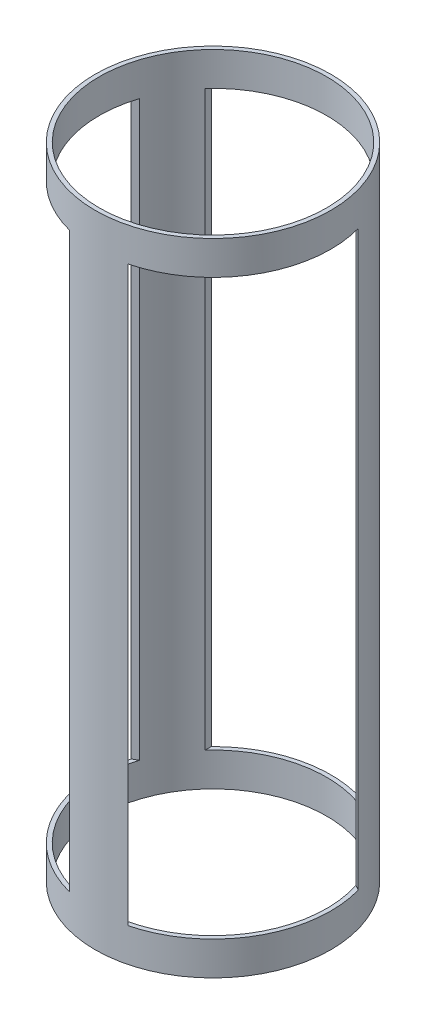
ISO-10303-21;
HEADER;
FILE_DESCRIPTION(('STEP AP214'),'2;1');
FILE_NAME('part.step','',(''),(''),'','','');
FILE_SCHEMA(('AUTOMOTIVE_DESIGN { 1 0 10303 214 1 1 1 1 }'));
ENDSEC;
DATA;
#1=APPLICATION_CONTEXT('core data for automotive mechanical design processes');
#2=APPLICATION_PROTOCOL_DEFINITION('international standard','automotive_design',2000,#1);
#3=PRODUCT_CONTEXT('',#1,'mechanical');
#4=PRODUCT('Part','Part','',(#3));
#5=PRODUCT_RELATED_PRODUCT_CATEGORY('part','',(#4));
#6=PRODUCT_DEFINITION_FORMATION('','',#4);
#7=PRODUCT_DEFINITION_CONTEXT('part definition',#1,'design');
#8=PRODUCT_DEFINITION('design','',#6,#7);
#9=PRODUCT_DEFINITION_SHAPE('','',#8);
#10=(LENGTH_UNIT() NAMED_UNIT(*) SI_UNIT(.MILLI.,.METRE.));
#11=(NAMED_UNIT(*) PLANE_ANGLE_UNIT() SI_UNIT($,.RADIAN.));
#12=(NAMED_UNIT(*) SI_UNIT($,.STERADIAN.) SOLID_ANGLE_UNIT());
#13=UNCERTAINTY_MEASURE_WITH_UNIT(LENGTH_MEASURE(1.E-05),#10,'distance_accuracy_value','');
#14=(GEOMETRIC_REPRESENTATION_CONTEXT(3) GLOBAL_UNCERTAINTY_ASSIGNED_CONTEXT((#13)) GLOBAL_UNIT_ASSIGNED_CONTEXT((#10,
#11,#12)) REPRESENTATION_CONTEXT('',''));
#15=CARTESIAN_POINT('',(0.,0.,0.));
#16=DIRECTION('',(0.,0.,1.));
#17=DIRECTION('',(1.,0.,0.));
#18=AXIS2_PLACEMENT_3D('',#15,#16,#17);
#19=CARTESIAN_POINT('',(0.,241.427,0.));
#20=DIRECTION('',(0.,1.,0.));
#21=DIRECTION('',(0.,0.,1.));
#22=AXIS2_PLACEMENT_3D('',#19,#20,#21);
#23=PLANE('',#22);
#24=CARTESIAN_POINT('',(0.,241.427,0.));
#25=DIRECTION('',(0.,1.,0.));
#26=DIRECTION('',(0.,0.,1.));
#27=AXIS2_PLACEMENT_3D('',#24,#25,#26);
#28=CIRCLE('',#27,88.9);
#29=CARTESIAN_POINT('',(0.,241.427,88.9));
#30=VERTEX_POINT('',#29);
#31=EDGE_CURVE('E259',#30,#30,#28,.T.);
#32=ORIENTED_EDGE('',*,*,#31,.T.);
#33=EDGE_LOOP('',(#32));
#34=FACE_BOUND('',#33,.T.);
#35=CARTESIAN_POINT('',(0.,241.427,0.));
#36=DIRECTION('',(0.,1.,0.));
#37=DIRECTION('',(0.,0.,1.));
#38=AXIS2_PLACEMENT_3D('',#35,#36,#37);
#39=CIRCLE('',#38,85.725);
#40=CARTESIAN_POINT('',(0.,241.427,85.725));
#41=VERTEX_POINT('',#40);
#42=EDGE_CURVE('E251',#41,#41,#39,.T.);
#43=ORIENTED_EDGE('',*,*,#42,.F.);
#44=EDGE_LOOP('',(#43));
#45=FACE_BOUND('',#44,.T.);
#46=ADVANCED_FACE('F40',(#34,#45),#23,.T.);
#47=CARTESIAN_POINT('',(0.,-241.427,0.));
#48=DIRECTION('',(0.,1.,0.));
#49=DIRECTION('',(0.,0.,1.));
#50=AXIS2_PLACEMENT_3D('',#47,#48,#49);
#51=PLANE('',#50);
#52=CARTESIAN_POINT('',(0.,-241.427,0.));
#53=DIRECTION('',(0.,1.,0.));
#54=DIRECTION('',(0.,0.,1.));
#55=AXIS2_PLACEMENT_3D('',#52,#53,#54);
#56=CIRCLE('',#55,88.9);
#57=CARTESIAN_POINT('',(0.,-241.427,88.9));
#58=VERTEX_POINT('',#57);
#59=EDGE_CURVE('E255',#58,#58,#56,.T.);
#60=ORIENTED_EDGE('',*,*,#59,.F.);
#61=EDGE_LOOP('',(#60));
#62=FACE_BOUND('',#61,.T.);
#63=CARTESIAN_POINT('',(0.,-241.427,0.));
#64=DIRECTION('',(0.,1.,0.));
#65=DIRECTION('',(0.,0.,1.));
#66=AXIS2_PLACEMENT_3D('',#63,#64,#65);
#67=CIRCLE('',#66,85.725);
#68=CARTESIAN_POINT('',(0.,-241.427,85.725));
#69=VERTEX_POINT('',#68);
#70=EDGE_CURVE('E224',#69,#69,#67,.T.);
#71=ORIENTED_EDGE('',*,*,#70,.T.);
#72=EDGE_LOOP('',(#71));
#73=FACE_BOUND('',#72,.T.);
#74=ADVANCED_FACE('F294',(#62,#73),#51,.F.);
#75=CARTESIAN_POINT('',(0.,241.427,0.));
#76=DIRECTION('',(0.,-1.,0.));
#77=DIRECTION('',(0.,0.,-1.));
#78=AXIS2_PLACEMENT_3D('',#75,#76,#77);
#79=CYLINDRICAL_SURFACE('',#78,88.9);
#80=CARTESIAN_POINT('',(0.,-216.027,0.));
#81=DIRECTION('',(0.,-1.,0.));
#82=DIRECTION('',(0.866025403784436,0.,0.500000000000004));
#83=AXIS2_PLACEMENT_3D('',#80,#81,#82);
#84=CIRCLE('',#83,88.9);
#85=CARTESIAN_POINT('',(22.1315367264145,-216.027,86.1011328736583));
#86=VERTEX_POINT('',#85);
#87=CARTESIAN_POINT('',(85.631536726415,-216.027,-23.8840934069651));
#88=VERTEX_POINT('',#87);
#89=EDGE_CURVE('E170',#86,#88,#84,.F.);
#90=ORIENTED_EDGE('',*,*,#89,.F.);
#91=DIRECTION('',(0.,-1.,0.));
#92=VECTOR('',#91,1.);
#93=CARTESIAN_POINT('',(22.1315367264145,241.427,86.1011328736583));
#94=LINE('',#93,#92);
#95=CARTESIAN_POINT('',(22.1315367264145,216.027,86.1011328736583));
#96=VERTEX_POINT('',#95);
#97=EDGE_CURVE('E177',#96,#86,#94,.T.);
#98=ORIENTED_EDGE('',*,*,#97,.F.);
#99=CARTESIAN_POINT('',(0.,216.027,0.));
#100=DIRECTION('',(0.,1.,0.));
#101=DIRECTION('',(-0.866025403784436,0.,-0.500000000000004));
#102=AXIS2_PLACEMENT_3D('',#99,#100,#101);
#103=CIRCLE('',#102,88.9);
#104=CARTESIAN_POINT('',(85.631536726415,216.027,-23.8840934069651));
#105=VERTEX_POINT('',#104);
#106=EDGE_CURVE('E142',#105,#96,#103,.F.);
#107=ORIENTED_EDGE('',*,*,#106,.F.);
#108=DIRECTION('',(0.,-1.,0.));
#109=VECTOR('',#108,1.);
#110=CARTESIAN_POINT('',(85.631536726415,241.427,-23.8840934069651));
#111=LINE('',#110,#109);
#112=EDGE_CURVE('E56',#88,#105,#111,.F.);
#113=ORIENTED_EDGE('',*,*,#112,.F.);
#114=EDGE_LOOP('',(#90,#98,#107,#113));
#115=FACE_BOUND('',#114,.T.);
#116=CARTESIAN_POINT('',(0.,-216.027,0.));
#117=DIRECTION('',(0.,-1.,0.));
#118=DIRECTION('',(-0.866025403784443,0.,0.499999999999992));
#119=AXIS2_PLACEMENT_3D('',#116,#117,#118);
#120=CIRCLE('',#119,88.9);
#121=CARTESIAN_POINT('',(-85.6315367264147,-216.027,-23.8840934069663));
#122=VERTEX_POINT('',#121);
#123=CARTESIAN_POINT('',(-22.1315367264157,-216.027,86.101132873658));
#124=VERTEX_POINT('',#123);
#125=EDGE_CURVE('E211',#122,#124,#120,.F.);
#126=ORIENTED_EDGE('',*,*,#125,.F.);
#127=DIRECTION('',(0.,-1.,0.));
#128=VECTOR('',#127,1.);
#129=CARTESIAN_POINT('',(-85.6315367264147,241.427,-23.8840934069663));
#130=LINE('',#129,#128);
#131=CARTESIAN_POINT('',(-85.6315367264147,216.027,-23.8840934069663));
#132=VERTEX_POINT('',#131);
#133=EDGE_CURVE('E143',#132,#122,#130,.T.);
#134=ORIENTED_EDGE('',*,*,#133,.F.);
#135=CARTESIAN_POINT('',(0.,216.027,0.));
#136=DIRECTION('',(0.,1.,0.));
#137=DIRECTION('',(0.866025403784443,0.,-0.499999999999992));
#138=AXIS2_PLACEMENT_3D('',#135,#136,#137);
#139=CIRCLE('',#138,88.9);
#140=CARTESIAN_POINT('',(-22.1315367264157,216.027,86.101132873658));
#141=VERTEX_POINT('',#140);
#142=EDGE_CURVE('E185',#141,#132,#139,.F.);
#143=ORIENTED_EDGE('',*,*,#142,.F.);
#144=DIRECTION('',(0.,-1.,0.));
#145=VECTOR('',#144,1.);
#146=CARTESIAN_POINT('',(-22.1315367264157,241.427,86.101132873658));
#147=LINE('',#146,#145);
#148=EDGE_CURVE('E64',#124,#141,#147,.F.);
#149=ORIENTED_EDGE('',*,*,#148,.F.);
#150=EDGE_LOOP('',(#126,#134,#143,#149));
#151=FACE_BOUND('',#150,.T.);
#152=CARTESIAN_POINT('',(0.,-216.027,0.));
#153=DIRECTION('',(0.,-1.,0.));
#154=DIRECTION('',(0.,0.,-1.));
#155=AXIS2_PLACEMENT_3D('',#152,#153,#154);
#156=CIRCLE('',#155,88.9);
#157=CARTESIAN_POINT('',(63.5,-216.027,-62.2170394666927));
#158=VERTEX_POINT('',#157);
#159=CARTESIAN_POINT('',(-63.5,-216.027,-62.2170394666927));
#160=VERTEX_POINT('',#159);
#161=EDGE_CURVE('E225',#158,#160,#156,.F.);
#162=ORIENTED_EDGE('',*,*,#161,.F.);
#163=DIRECTION('',(0.,-1.,0.));
#164=VECTOR('',#163,1.);
#165=CARTESIAN_POINT('',(63.5,241.427,-62.2170394666927));
#166=LINE('',#165,#164);
#167=CARTESIAN_POINT('',(63.5,216.027,-62.2170394666927));
#168=VERTEX_POINT('',#167);
#169=EDGE_CURVE('E229',#168,#158,#166,.T.);
#170=ORIENTED_EDGE('',*,*,#169,.F.);
#171=CARTESIAN_POINT('',(0.,216.027,0.));
#172=DIRECTION('',(0.,1.,0.));
#173=DIRECTION('',(0.,0.,1.));
#174=AXIS2_PLACEMENT_3D('',#171,#172,#173);
#175=CIRCLE('',#174,88.9);
#176=CARTESIAN_POINT('',(-63.5,216.027,-62.2170394666927));
#177=VERTEX_POINT('',#176);
#178=EDGE_CURVE('E233',#177,#168,#175,.F.);
#179=ORIENTED_EDGE('',*,*,#178,.F.);
#180=DIRECTION('',(0.,-1.,0.));
#181=VECTOR('',#180,1.);
#182=CARTESIAN_POINT('',(-63.5,241.427,-62.2170394666927));
#183=LINE('',#182,#181);
#184=EDGE_CURVE('E221',#160,#177,#183,.F.);
#185=ORIENTED_EDGE('',*,*,#184,.F.);
#186=EDGE_LOOP('',(#162,#170,#179,#185));
#187=FACE_BOUND('',#186,.T.);
#188=ORIENTED_EDGE('',*,*,#31,.F.);
#189=EDGE_LOOP('',(#188));
#190=FACE_BOUND('',#189,.T.);
#191=ORIENTED_EDGE('',*,*,#59,.T.);
#192=EDGE_LOOP('',(#191));
#193=FACE_BOUND('',#192,.T.);
#194=ADVANCED_FACE('F42',(#115,#151,#187,#190,#193),#79,.T.);
#195=CARTESIAN_POINT('',(0.,241.427,0.));
#196=DIRECTION('',(0.,-1.,0.));
#197=DIRECTION('',(0.,0.,-1.));
#198=AXIS2_PLACEMENT_3D('',#195,#196,#197);
#199=CYLINDRICAL_SURFACE('',#198,85.725);
#200=DIRECTION('',(0.,-1.,0.));
#201=VECTOR('',#200,1.);
#202=CARTESIAN_POINT('',(18.1237828798855,241.427,83.787255111519));
#203=LINE('',#202,#201);
#204=CARTESIAN_POINT('',(18.1237828798855,-216.027,83.787255111519));
#205=VERTEX_POINT('',#204);
#206=CARTESIAN_POINT('',(18.1237828798855,216.027,83.787255111519));
#207=VERTEX_POINT('',#206);
#208=EDGE_CURVE('E174',#205,#207,#203,.F.);
#209=ORIENTED_EDGE('',*,*,#208,.F.);
#210=CARTESIAN_POINT('',(0.,-216.027,0.));
#211=DIRECTION('',(0.,-1.,0.));
#212=DIRECTION('',(0.866025403784436,0.,0.500000000000004));
#213=AXIS2_PLACEMENT_3D('',#210,#211,#212);
#214=CIRCLE('',#213,85.725);
#215=CARTESIAN_POINT('',(81.623782879886,-216.027,-26.1979711691044));
#216=VERTEX_POINT('',#215);
#217=EDGE_CURVE('E153',#216,#205,#214,.T.);
#218=ORIENTED_EDGE('',*,*,#217,.F.);
#219=DIRECTION('',(0.,-1.,0.));
#220=VECTOR('',#219,1.);
#221=CARTESIAN_POINT('',(81.623782879886,241.427,-26.1979711691044));
#222=LINE('',#221,#220);
#223=CARTESIAN_POINT('',(81.623782879886,216.027,-26.1979711691044));
#224=VERTEX_POINT('',#223);
#225=EDGE_CURVE('E146',#224,#216,#222,.T.);
#226=ORIENTED_EDGE('',*,*,#225,.F.);
#227=CARTESIAN_POINT('',(0.,216.027,0.));
#228=DIRECTION('',(0.,1.,0.));
#229=DIRECTION('',(-0.866025403784436,0.,-0.500000000000004));
#230=AXIS2_PLACEMENT_3D('',#227,#228,#229);
#231=CIRCLE('',#230,85.725);
#232=EDGE_CURVE('E132',#207,#224,#231,.T.);
#233=ORIENTED_EDGE('',*,*,#232,.F.);
#234=EDGE_LOOP('',(#209,#218,#226,#233));
#235=FACE_BOUND('',#234,.T.);
#236=DIRECTION('',(0.,-1.,0.));
#237=VECTOR('',#236,1.);
#238=CARTESIAN_POINT('',(-81.6237828798856,241.427,-26.1979711691055));
#239=LINE('',#238,#237);
#240=CARTESIAN_POINT('',(-81.6237828798856,-216.027,-26.1979711691055));
#241=VERTEX_POINT('',#240);
#242=CARTESIAN_POINT('',(-81.6237828798857,216.027,-26.1979711691055));
#243=VERTEX_POINT('',#242);
#244=EDGE_CURVE('E215',#241,#243,#239,.F.);
#245=ORIENTED_EDGE('',*,*,#244,.F.);
#246=CARTESIAN_POINT('',(0.,-216.027,0.));
#247=DIRECTION('',(0.,-1.,0.));
#248=DIRECTION('',(-0.866025403784443,0.,0.499999999999992));
#249=AXIS2_PLACEMENT_3D('',#246,#247,#248);
#250=CIRCLE('',#249,85.725);
#251=CARTESIAN_POINT('',(-18.1237828798867,-216.027,83.7872551115187));
#252=VERTEX_POINT('',#251);
#253=EDGE_CURVE('E204',#252,#241,#250,.T.);
#254=ORIENTED_EDGE('',*,*,#253,.F.);
#255=DIRECTION('',(0.,-1.,0.));
#256=VECTOR('',#255,1.);
#257=CARTESIAN_POINT('',(-18.1237828798867,241.427,83.7872551115187));
#258=LINE('',#257,#256);
#259=CARTESIAN_POINT('',(-18.1237828798867,216.027,83.7872551115187));
#260=VERTEX_POINT('',#259);
#261=EDGE_CURVE('E195',#260,#252,#258,.T.);
#262=ORIENTED_EDGE('',*,*,#261,.F.);
#263=CARTESIAN_POINT('',(0.,216.027,0.));
#264=DIRECTION('',(0.,1.,0.));
#265=DIRECTION('',(0.866025403784443,0.,-0.499999999999992));
#266=AXIS2_PLACEMENT_3D('',#263,#264,#265);
#267=CIRCLE('',#266,85.725);
#268=EDGE_CURVE('E182',#243,#260,#267,.T.);
#269=ORIENTED_EDGE('',*,*,#268,.F.);
#270=EDGE_LOOP('',(#245,#254,#262,#269));
#271=FACE_BOUND('',#270,.T.);
#272=DIRECTION('',(0.,-1.,0.));
#273=VECTOR('',#272,1.);
#274=CARTESIAN_POINT('',(63.5,241.427,-57.5892839424141));
#275=LINE('',#274,#273);
#276=CARTESIAN_POINT('',(63.5,-216.027,-57.5892839424141));
#277=VERTEX_POINT('',#276);
#278=CARTESIAN_POINT('',(63.5,216.027,-57.5892839424141));
#279=VERTEX_POINT('',#278);
#280=EDGE_CURVE('E11',#277,#279,#275,.F.);
#281=ORIENTED_EDGE('',*,*,#280,.F.);
#282=CARTESIAN_POINT('',(0.,-216.027,0.));
#283=DIRECTION('',(0.,-1.,0.));
#284=DIRECTION('',(0.,0.,-1.));
#285=AXIS2_PLACEMENT_3D('',#282,#283,#284);
#286=CIRCLE('',#285,85.725);
#287=CARTESIAN_POINT('',(-63.5,-216.027,-57.5892839424141));
#288=VERTEX_POINT('',#287);
#289=EDGE_CURVE('E49',#288,#277,#286,.T.);
#290=ORIENTED_EDGE('',*,*,#289,.F.);
#291=DIRECTION('',(0.,-1.,0.));
#292=VECTOR('',#291,1.);
#293=CARTESIAN_POINT('',(-63.5,241.427,-57.5892839424141));
#294=LINE('',#293,#292);
#295=CARTESIAN_POINT('',(-63.5,216.027,-57.5892839424141));
#296=VERTEX_POINT('',#295);
#297=EDGE_CURVE('E269',#296,#288,#294,.T.);
#298=ORIENTED_EDGE('',*,*,#297,.F.);
#299=CARTESIAN_POINT('',(0.,216.027,0.));
#300=DIRECTION('',(0.,1.,0.));
#301=DIRECTION('',(0.,0.,1.));
#302=AXIS2_PLACEMENT_3D('',#299,#300,#301);
#303=CIRCLE('',#302,85.725);
#304=EDGE_CURVE('E263',#279,#296,#303,.T.);
#305=ORIENTED_EDGE('',*,*,#304,.F.);
#306=EDGE_LOOP('',(#281,#290,#298,#305));
#307=FACE_BOUND('',#306,.T.);
#308=ORIENTED_EDGE('',*,*,#42,.T.);
#309=EDGE_LOOP('',(#308));
#310=FACE_BOUND('',#309,.T.);
#311=ORIENTED_EDGE('',*,*,#70,.F.);
#312=EDGE_LOOP('',(#311));
#313=FACE_BOUND('',#312,.T.);
#314=ADVANCED_FACE('F151',(#235,#271,#307,#310,#313),#199,.F.);
#315=CARTESIAN_POINT('',(63.5,-216.027,-88.901));
#316=DIRECTION('',(1.,0.,0.));
#317=DIRECTION('',(0.,0.,-1.));
#318=AXIS2_PLACEMENT_3D('',#315,#316,#317);
#319=PLANE('',#318);
#320=ORIENTED_EDGE('',*,*,#280,.T.);
#321=DIRECTION('',(0.,0.,1.));
#322=VECTOR('',#321,1.);
#323=CARTESIAN_POINT('',(63.5,216.027,-88.901));
#324=LINE('',#323,#322);
#325=EDGE_CURVE('E181',#168,#279,#324,.T.);
#326=ORIENTED_EDGE('',*,*,#325,.F.);
#327=ORIENTED_EDGE('',*,*,#169,.T.);
#328=DIRECTION('',(0.,0.,1.));
#329=VECTOR('',#328,1.);
#330=CARTESIAN_POINT('',(63.5,-216.027,-88.901));
#331=LINE('',#330,#329);
#332=EDGE_CURVE('E238',#158,#277,#331,.T.);
#333=ORIENTED_EDGE('',*,*,#332,.T.);
#334=EDGE_LOOP('',(#320,#326,#327,#333));
#335=FACE_BOUND('',#334,.T.);
#336=ADVANCED_FACE('F279',(#335),#319,.F.);
#337=CARTESIAN_POINT('',(-63.5,-216.027,-88.901));
#338=DIRECTION('',(0.,-1.,0.));
#339=DIRECTION('',(0.,0.,-1.));
#340=AXIS2_PLACEMENT_3D('',#337,#338,#339);
#341=PLANE('',#340);
#342=ORIENTED_EDGE('',*,*,#289,.T.);
#343=ORIENTED_EDGE('',*,*,#332,.F.);
#344=ORIENTED_EDGE('',*,*,#161,.T.);
#345=DIRECTION('',(0.,0.,1.));
#346=VECTOR('',#345,1.);
#347=CARTESIAN_POINT('',(-63.5,-216.027,-88.901));
#348=LINE('',#347,#346);
#349=EDGE_CURVE('E242',#160,#288,#348,.T.);
#350=ORIENTED_EDGE('',*,*,#349,.T.);
#351=EDGE_LOOP('',(#342,#343,#344,#350));
#352=FACE_BOUND('',#351,.T.);
#353=ADVANCED_FACE('F274',(#352),#341,.F.);
#354=CARTESIAN_POINT('',(-63.5,-216.027,-88.901));
#355=DIRECTION('',(-1.,0.,0.));
#356=DIRECTION('',(0.,0.,1.));
#357=AXIS2_PLACEMENT_3D('',#354,#355,#356);
#358=PLANE('',#357);
#359=ORIENTED_EDGE('',*,*,#297,.T.);
#360=ORIENTED_EDGE('',*,*,#349,.F.);
#361=ORIENTED_EDGE('',*,*,#184,.T.);
#362=DIRECTION('',(0.,0.,1.));
#363=VECTOR('',#362,1.);
#364=CARTESIAN_POINT('',(-63.5,216.027,-88.901));
#365=LINE('',#364,#363);
#366=EDGE_CURVE('E237',#177,#296,#365,.T.);
#367=ORIENTED_EDGE('',*,*,#366,.T.);
#368=EDGE_LOOP('',(#359,#360,#361,#367));
#369=FACE_BOUND('',#368,.T.);
#370=ADVANCED_FACE('F289',(#369),#358,.F.);
#371=CARTESIAN_POINT('',(-63.5,216.027,-88.901));
#372=DIRECTION('',(0.,1.,0.));
#373=DIRECTION('',(0.,0.,1.));
#374=AXIS2_PLACEMENT_3D('',#371,#372,#373);
#375=PLANE('',#374);
#376=ORIENTED_EDGE('',*,*,#304,.T.);
#377=ORIENTED_EDGE('',*,*,#366,.F.);
#378=ORIENTED_EDGE('',*,*,#178,.T.);
#379=ORIENTED_EDGE('',*,*,#325,.T.);
#380=EDGE_LOOP('',(#376,#377,#378,#379));
#381=FACE_BOUND('',#380,.T.);
#382=ADVANCED_FACE('F286',(#381),#375,.F.);
#383=CARTESIAN_POINT('',(-108.74052442184,-216.027,-10.5421131403129));
#384=DIRECTION('',(-0.499999999999992,0.,-0.866025403784443));
#385=DIRECTION('',(-0.866025403784443,0.,0.499999999999992));
#386=AXIS2_PLACEMENT_3D('',#383,#384,#385);
#387=PLANE('',#386);
#388=ORIENTED_EDGE('',*,*,#244,.T.);
#389=DIRECTION('',(0.866025403784443,0.,-0.499999999999992));
#390=VECTOR('',#389,1.);
#391=CARTESIAN_POINT('',(-108.74052442184,216.027,-10.5421131403129));
#392=LINE('',#391,#390);
#393=EDGE_CURVE('E191',#132,#243,#392,.T.);
#394=ORIENTED_EDGE('',*,*,#393,.F.);
#395=ORIENTED_EDGE('',*,*,#133,.T.);
#396=DIRECTION('',(0.866025403784443,0.,-0.499999999999992));
#397=VECTOR('',#396,1.);
#398=CARTESIAN_POINT('',(-108.74052442184,-216.027,-10.5421131403129));
#399=LINE('',#398,#397);
#400=EDGE_CURVE('E207',#122,#241,#399,.T.);
#401=ORIENTED_EDGE('',*,*,#400,.T.);
#402=EDGE_LOOP('',(#388,#394,#395,#401));
#403=FACE_BOUND('',#402,.T.);
#404=ADVANCED_FACE('F341',(#403),#387,.F.);
#405=CARTESIAN_POINT('',(-45.2405244218413,-216.027,99.4431131403114));
#406=DIRECTION('',(0.,-1.,0.));
#407=DIRECTION('',(-0.866025403784443,0.,0.499999999999992));
#408=AXIS2_PLACEMENT_3D('',#405,#406,#407);
#409=PLANE('',#408);
#410=ORIENTED_EDGE('',*,*,#253,.T.);
#411=ORIENTED_EDGE('',*,*,#400,.F.);
#412=ORIENTED_EDGE('',*,*,#125,.T.);
#413=DIRECTION('',(0.866025403784443,0.,-0.499999999999992));
#414=VECTOR('',#413,1.);
#415=CARTESIAN_POINT('',(-45.2405244218413,-216.027,99.4431131403114));
#416=LINE('',#415,#414);
#417=EDGE_CURVE('E198',#124,#252,#416,.T.);
#418=ORIENTED_EDGE('',*,*,#417,.T.);
#419=EDGE_LOOP('',(#410,#411,#412,#418));
#420=FACE_BOUND('',#419,.T.);
#421=ADVANCED_FACE('F347',(#420),#409,.F.);
#422=CARTESIAN_POINT('',(-45.2405244218413,-216.027,99.4431131403114));
#423=DIRECTION('',(0.499999999999992,0.,0.866025403784443));
#424=DIRECTION('',(0.866025403784443,0.,-0.499999999999992));
#425=AXIS2_PLACEMENT_3D('',#422,#423,#424);
#426=PLANE('',#425);
#427=ORIENTED_EDGE('',*,*,#261,.T.);
#428=ORIENTED_EDGE('',*,*,#417,.F.);
#429=ORIENTED_EDGE('',*,*,#148,.T.);
#430=DIRECTION('',(0.866025403784443,0.,-0.499999999999992));
#431=VECTOR('',#430,1.);
#432=CARTESIAN_POINT('',(-45.2405244218413,216.027,99.4431131403114));
#433=LINE('',#432,#431);
#434=EDGE_CURVE('E188',#141,#260,#433,.T.);
#435=ORIENTED_EDGE('',*,*,#434,.T.);
#436=EDGE_LOOP('',(#427,#428,#429,#435));
#437=FACE_BOUND('',#436,.T.);
#438=ADVANCED_FACE('F358',(#437),#426,.F.);
#439=CARTESIAN_POINT('',(-45.2405244218413,216.027,99.4431131403114));
#440=DIRECTION('',(0.,1.,0.));
#441=DIRECTION('',(0.866025403784443,0.,-0.499999999999992));
#442=AXIS2_PLACEMENT_3D('',#439,#440,#441);
#443=PLANE('',#442);
#444=ORIENTED_EDGE('',*,*,#268,.T.);
#445=ORIENTED_EDGE('',*,*,#434,.F.);
#446=ORIENTED_EDGE('',*,*,#142,.T.);
#447=ORIENTED_EDGE('',*,*,#393,.T.);
#448=EDGE_LOOP('',(#444,#445,#446,#447));
#449=FACE_BOUND('',#448,.T.);
#450=ADVANCED_FACE('F369',(#449),#443,.F.);
#451=CARTESIAN_POINT('',(45.2405244218399,-216.027,99.4431131403121));
#452=DIRECTION('',(-0.500000000000004,0.,0.866025403784436));
#453=DIRECTION('',(0.866025403784436,0.,0.500000000000004));
#454=AXIS2_PLACEMENT_3D('',#451,#452,#453);
#455=PLANE('',#454);
#456=ORIENTED_EDGE('',*,*,#208,.T.);
#457=DIRECTION('',(-0.866025403784436,0.,-0.500000000000004));
#458=VECTOR('',#457,1.);
#459=CARTESIAN_POINT('',(45.2405244218399,216.027,99.4431131403121));
#460=LINE('',#459,#458);
#461=EDGE_CURVE('E137',#96,#207,#460,.T.);
#462=ORIENTED_EDGE('',*,*,#461,.F.);
#463=ORIENTED_EDGE('',*,*,#97,.T.);
#464=DIRECTION('',(-0.866025403784436,0.,-0.500000000000004));
#465=VECTOR('',#464,1.);
#466=CARTESIAN_POINT('',(45.2405244218399,-216.027,99.4431131403121));
#467=LINE('',#466,#465);
#468=EDGE_CURVE('E166',#86,#205,#467,.T.);
#469=ORIENTED_EDGE('',*,*,#468,.T.);
#470=EDGE_LOOP('',(#456,#462,#463,#469));
#471=FACE_BOUND('',#470,.T.);
#472=ADVANCED_FACE('F379',(#471),#455,.F.);
#473=CARTESIAN_POINT('',(108.74052442184,-216.027,-10.5421131403114));
#474=DIRECTION('',(0.,-1.,0.));
#475=DIRECTION('',(0.866025403784436,0.,0.500000000000004));
#476=AXIS2_PLACEMENT_3D('',#473,#474,#475);
#477=PLANE('',#476);
#478=ORIENTED_EDGE('',*,*,#217,.T.);
#479=ORIENTED_EDGE('',*,*,#468,.F.);
#480=ORIENTED_EDGE('',*,*,#89,.T.);
#481=DIRECTION('',(-0.866025403784436,0.,-0.500000000000004));
#482=VECTOR('',#481,1.);
#483=CARTESIAN_POINT('',(108.74052442184,-216.027,-10.5421131403114));
#484=LINE('',#483,#482);
#485=EDGE_CURVE('E155',#88,#216,#484,.T.);
#486=ORIENTED_EDGE('',*,*,#485,.T.);
#487=EDGE_LOOP('',(#478,#479,#480,#486));
#488=FACE_BOUND('',#487,.T.);
#489=ADVANCED_FACE('F390',(#488),#477,.F.);
#490=CARTESIAN_POINT('',(108.74052442184,-216.027,-10.5421131403114));
#491=DIRECTION('',(0.500000000000004,0.,-0.866025403784436));
#492=DIRECTION('',(-0.866025403784436,0.,-0.500000000000004));
#493=AXIS2_PLACEMENT_3D('',#490,#491,#492);
#494=PLANE('',#493);
#495=ORIENTED_EDGE('',*,*,#225,.T.);
#496=ORIENTED_EDGE('',*,*,#485,.F.);
#497=ORIENTED_EDGE('',*,*,#112,.T.);
#498=DIRECTION('',(-0.866025403784436,0.,-0.500000000000004));
#499=VECTOR('',#498,1.);
#500=CARTESIAN_POINT('',(108.74052442184,216.027,-10.5421131403114));
#501=LINE('',#500,#499);
#502=EDGE_CURVE('E134',#105,#224,#501,.T.);
#503=ORIENTED_EDGE('',*,*,#502,.T.);
#504=EDGE_LOOP('',(#495,#496,#497,#503));
#505=FACE_BOUND('',#504,.T.);
#506=ADVANCED_FACE('F145',(#505),#494,.F.);
#507=CARTESIAN_POINT('',(108.74052442184,216.027,-10.5421131403114));
#508=DIRECTION('',(0.,1.,0.));
#509=DIRECTION('',(-0.866025403784436,0.,-0.500000000000004));
#510=AXIS2_PLACEMENT_3D('',#507,#508,#509);
#511=PLANE('',#510);
#512=ORIENTED_EDGE('',*,*,#232,.T.);
#513=ORIENTED_EDGE('',*,*,#502,.F.);
#514=ORIENTED_EDGE('',*,*,#106,.T.);
#515=ORIENTED_EDGE('',*,*,#461,.T.);
#516=EDGE_LOOP('',(#512,#513,#514,#515));
#517=FACE_BOUND('',#516,.T.);
#518=ADVANCED_FACE('F133',(#517),#511,.F.);
#519=CLOSED_SHELL('',(#46,#74,#194,#314,#336,#353,#370,#382,#404,#421,#438,#450,#472,#489,#506,#518));
#520=MANIFOLD_SOLID_BREP('B2',#519);
#521=ADVANCED_BREP_SHAPE_REPRESENTATION('',(#18,#520),#14);
#522=SHAPE_DEFINITION_REPRESENTATION(#9,#521);
ENDSEC;
END-ISO-10303-21;
